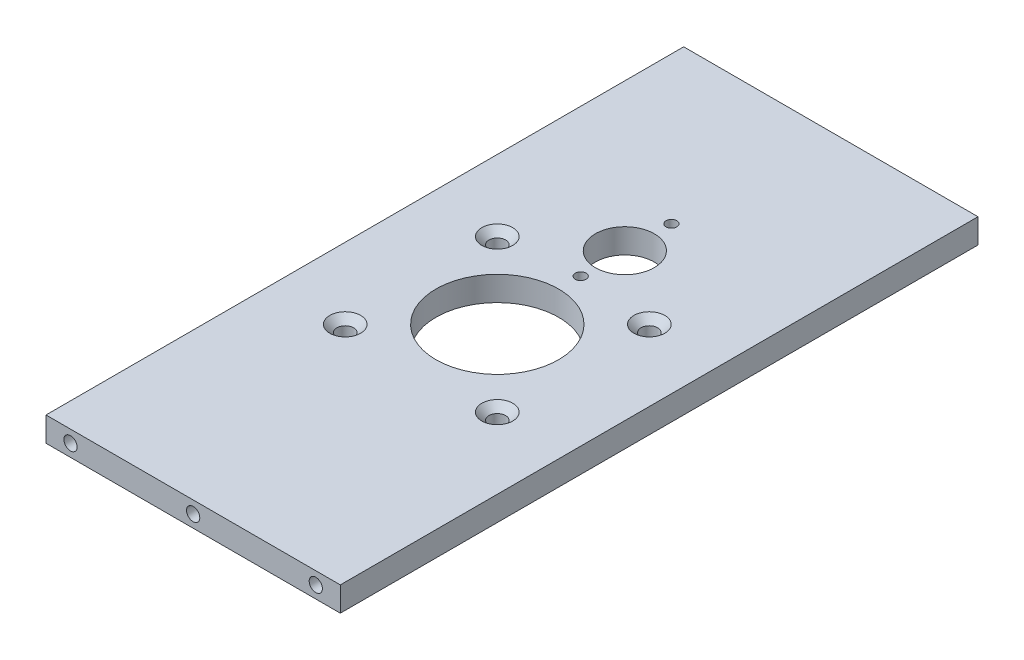
ISO-10303-21;
HEADER;
FILE_DESCRIPTION(('STEP AP214'),'2;1');
FILE_NAME('part.step','',(''),(''),'','','');
FILE_SCHEMA(('AUTOMOTIVE_DESIGN { 1 0 10303 214 1 1 1 1 }'));
ENDSEC;
DATA;
#1=APPLICATION_CONTEXT('core data for automotive mechanical design processes');
#2=APPLICATION_PROTOCOL_DEFINITION('international standard','automotive_design',2000,#1);
#3=PRODUCT_CONTEXT('',#1,'mechanical');
#4=PRODUCT('Part','Part','',(#3));
#5=PRODUCT_RELATED_PRODUCT_CATEGORY('part','',(#4));
#6=PRODUCT_DEFINITION_FORMATION('','',#4);
#7=PRODUCT_DEFINITION_CONTEXT('part definition',#1,'design');
#8=PRODUCT_DEFINITION('design','',#6,#7);
#9=PRODUCT_DEFINITION_SHAPE('','',#8);
#10=(LENGTH_UNIT() NAMED_UNIT(*) SI_UNIT(.MILLI.,.METRE.));
#11=(NAMED_UNIT(*) PLANE_ANGLE_UNIT() SI_UNIT($,.RADIAN.));
#12=(NAMED_UNIT(*) SI_UNIT($,.STERADIAN.) SOLID_ANGLE_UNIT());
#13=UNCERTAINTY_MEASURE_WITH_UNIT(LENGTH_MEASURE(1.E-05),#10,'distance_accuracy_value','');
#14=(GEOMETRIC_REPRESENTATION_CONTEXT(3) GLOBAL_UNCERTAINTY_ASSIGNED_CONTEXT((#13)) GLOBAL_UNIT_ASSIGNED_CONTEXT((#10,
#11,#12)) REPRESENTATION_CONTEXT('',''));
#15=CARTESIAN_POINT('',(0.,0.,0.));
#16=DIRECTION('',(0.,0.,1.));
#17=DIRECTION('',(1.,0.,0.));
#18=AXIS2_PLACEMENT_3D('',#15,#16,#17);
#19=CARTESIAN_POINT('',(30.,5.,65.));
#20=DIRECTION('',(-1.,0.,0.));
#21=DIRECTION('',(0.,0.,1.));
#22=AXIS2_PLACEMENT_3D('',#19,#20,#21);
#23=PLANE('',#22);
#24=DIRECTION('',(0.,0.,-1.));
#25=VECTOR('',#24,1.);
#26=CARTESIAN_POINT('',(30.,0.,65.));
#27=LINE('',#26,#25);
#28=CARTESIAN_POINT('',(30.,0.,65.));
#29=VERTEX_POINT('',#28);
#30=CARTESIAN_POINT('',(30.,0.,-65.));
#31=VERTEX_POINT('',#30);
#32=EDGE_CURVE('E192',#29,#31,#27,.T.);
#33=ORIENTED_EDGE('',*,*,#32,.T.);
#34=DIRECTION('',(0.,-1.,0.));
#35=VECTOR('',#34,1.);
#36=CARTESIAN_POINT('',(30.,5.,-65.));
#37=LINE('',#36,#35);
#38=CARTESIAN_POINT('',(30.,5.,-65.));
#39=VERTEX_POINT('',#38);
#40=EDGE_CURVE('E11',#39,#31,#37,.T.);
#41=ORIENTED_EDGE('',*,*,#40,.F.);
#42=DIRECTION('',(0.,0.,-1.));
#43=VECTOR('',#42,1.);
#44=CARTESIAN_POINT('',(30.,5.,65.));
#45=LINE('',#44,#43);
#46=CARTESIAN_POINT('',(30.,5.,65.));
#47=VERTEX_POINT('',#46);
#48=EDGE_CURVE('E185',#47,#39,#45,.T.);
#49=ORIENTED_EDGE('',*,*,#48,.F.);
#50=DIRECTION('',(0.,-1.,0.));
#51=VECTOR('',#50,1.);
#52=CARTESIAN_POINT('',(30.,5.,65.));
#53=LINE('',#52,#51);
#54=EDGE_CURVE('E191',#47,#29,#53,.T.);
#55=ORIENTED_EDGE('',*,*,#54,.T.);
#56=EDGE_LOOP('',(#33,#41,#49,#55));
#57=FACE_BOUND('',#56,.T.);
#58=ADVANCED_FACE('F37',(#57),#23,.F.);
#59=CARTESIAN_POINT('',(-30.,5.,-65.));
#60=DIRECTION('',(0.,0.,1.));
#61=DIRECTION('',(1.,0.,0.));
#62=AXIS2_PLACEMENT_3D('',#59,#60,#61);
#63=PLANE('',#62);
#64=CARTESIAN_POINT('',(25.,2.5,-65.));
#65=DIRECTION('',(0.,0.,-1.));
#66=DIRECTION('',(-1.,0.,0.));
#67=AXIS2_PLACEMENT_3D('',#64,#65,#66);
#68=CIRCLE('',#67,1.35);
#69=CARTESIAN_POINT('',(23.65,2.5,-65.));
#70=VERTEX_POINT('',#69);
#71=EDGE_CURVE('E134',#70,#70,#68,.T.);
#72=ORIENTED_EDGE('',*,*,#71,.F.);
#73=EDGE_LOOP('',(#72));
#74=FACE_BOUND('',#73,.T.);
#75=CARTESIAN_POINT('',(0.,2.50000000000001,-65.));
#76=DIRECTION('',(0.,0.,-1.));
#77=DIRECTION('',(-1.,0.,0.));
#78=AXIS2_PLACEMENT_3D('',#75,#76,#77);
#79=CIRCLE('',#78,1.35);
#80=CARTESIAN_POINT('',(-1.35,2.50000000000001,-65.));
#81=VERTEX_POINT('',#80);
#82=EDGE_CURVE('E140',#81,#81,#79,.T.);
#83=ORIENTED_EDGE('',*,*,#82,.F.);
#84=EDGE_LOOP('',(#83));
#85=FACE_BOUND('',#84,.T.);
#86=CARTESIAN_POINT('',(-25.,2.50000000000001,-65.));
#87=DIRECTION('',(0.,0.,-1.));
#88=DIRECTION('',(-1.,0.,0.));
#89=AXIS2_PLACEMENT_3D('',#86,#87,#88);
#90=CIRCLE('',#89,1.35);
#91=CARTESIAN_POINT('',(-26.35,2.50000000000001,-65.));
#92=VERTEX_POINT('',#91);
#93=EDGE_CURVE('E146',#92,#92,#90,.T.);
#94=ORIENTED_EDGE('',*,*,#93,.F.);
#95=EDGE_LOOP('',(#94));
#96=FACE_BOUND('',#95,.T.);
#97=DIRECTION('',(-1.,0.,0.));
#98=VECTOR('',#97,1.);
#99=CARTESIAN_POINT('',(-30.,0.,-65.));
#100=LINE('',#99,#98);
#101=CARTESIAN_POINT('',(-30.,0.,-65.));
#102=VERTEX_POINT('',#101);
#103=EDGE_CURVE('E195',#31,#102,#100,.T.);
#104=ORIENTED_EDGE('',*,*,#103,.T.);
#105=DIRECTION('',(0.,-1.,0.));
#106=VECTOR('',#105,1.);
#107=CARTESIAN_POINT('',(-30.,5.,-65.));
#108=LINE('',#107,#106);
#109=CARTESIAN_POINT('',(-30.,5.,-65.));
#110=VERTEX_POINT('',#109);
#111=EDGE_CURVE('E46',#110,#102,#108,.T.);
#112=ORIENTED_EDGE('',*,*,#111,.F.);
#113=DIRECTION('',(-1.,0.,0.));
#114=VECTOR('',#113,1.);
#115=CARTESIAN_POINT('',(-30.,5.,-65.));
#116=LINE('',#115,#114);
#117=EDGE_CURVE('E86',#39,#110,#116,.T.);
#118=ORIENTED_EDGE('',*,*,#117,.F.);
#119=ORIENTED_EDGE('',*,*,#40,.T.);
#120=EDGE_LOOP('',(#104,#112,#118,#119));
#121=FACE_BOUND('',#120,.T.);
#122=ADVANCED_FACE('F230',(#74,#85,#96,#121),#63,.F.);
#123=CARTESIAN_POINT('',(-30.,5.,65.));
#124=DIRECTION('',(1.,0.,0.));
#125=DIRECTION('',(0.,0.,-1.));
#126=AXIS2_PLACEMENT_3D('',#123,#124,#125);
#127=PLANE('',#126);
#128=DIRECTION('',(0.,0.,1.));
#129=VECTOR('',#128,1.);
#130=CARTESIAN_POINT('',(-30.,0.,65.));
#131=LINE('',#130,#129);
#132=CARTESIAN_POINT('',(-30.,0.,65.));
#133=VERTEX_POINT('',#132);
#134=EDGE_CURVE('E73',#102,#133,#131,.T.);
#135=ORIENTED_EDGE('',*,*,#134,.T.);
#136=DIRECTION('',(0.,-1.,0.));
#137=VECTOR('',#136,1.);
#138=CARTESIAN_POINT('',(-30.,5.,65.));
#139=LINE('',#138,#137);
#140=CARTESIAN_POINT('',(-30.,5.,65.));
#141=VERTEX_POINT('',#140);
#142=EDGE_CURVE('E200',#141,#133,#139,.T.);
#143=ORIENTED_EDGE('',*,*,#142,.F.);
#144=DIRECTION('',(0.,0.,1.));
#145=VECTOR('',#144,1.);
#146=CARTESIAN_POINT('',(-30.,5.,65.));
#147=LINE('',#146,#145);
#148=EDGE_CURVE('E188',#110,#141,#147,.T.);
#149=ORIENTED_EDGE('',*,*,#148,.F.);
#150=ORIENTED_EDGE('',*,*,#111,.T.);
#151=EDGE_LOOP('',(#135,#143,#149,#150));
#152=FACE_BOUND('',#151,.T.);
#153=ADVANCED_FACE('F229',(#152),#127,.F.);
#154=CARTESIAN_POINT('',(-30.,5.,65.));
#155=DIRECTION('',(0.,0.,-1.));
#156=DIRECTION('',(-1.,0.,0.));
#157=AXIS2_PLACEMENT_3D('',#154,#155,#156);
#158=PLANE('',#157);
#159=CARTESIAN_POINT('',(25.,2.5,65.));
#160=DIRECTION('',(0.,0.,1.));
#161=DIRECTION('',(1.,0.,0.));
#162=AXIS2_PLACEMENT_3D('',#159,#160,#161);
#163=CIRCLE('',#162,1.35);
#164=CARTESIAN_POINT('',(26.35,2.5,65.));
#165=VERTEX_POINT('',#164);
#166=EDGE_CURVE('E116',#165,#165,#163,.T.);
#167=ORIENTED_EDGE('',*,*,#166,.F.);
#168=EDGE_LOOP('',(#167));
#169=FACE_BOUND('',#168,.T.);
#170=CARTESIAN_POINT('',(0.,2.50000000000001,65.));
#171=DIRECTION('',(0.,0.,1.));
#172=DIRECTION('',(1.,0.,0.));
#173=AXIS2_PLACEMENT_3D('',#170,#171,#172);
#174=CIRCLE('',#173,1.35);
#175=CARTESIAN_POINT('',(1.35,2.50000000000001,65.));
#176=VERTEX_POINT('',#175);
#177=EDGE_CURVE('E115',#176,#176,#174,.T.);
#178=ORIENTED_EDGE('',*,*,#177,.F.);
#179=EDGE_LOOP('',(#178));
#180=FACE_BOUND('',#179,.T.);
#181=CARTESIAN_POINT('',(-25.,2.50000000000001,65.));
#182=DIRECTION('',(0.,0.,1.));
#183=DIRECTION('',(1.,0.,0.));
#184=AXIS2_PLACEMENT_3D('',#181,#182,#183);
#185=CIRCLE('',#184,1.35);
#186=CARTESIAN_POINT('',(-23.65,2.50000000000001,65.));
#187=VERTEX_POINT('',#186);
#188=EDGE_CURVE('E128',#187,#187,#185,.T.);
#189=ORIENTED_EDGE('',*,*,#188,.F.);
#190=EDGE_LOOP('',(#189));
#191=FACE_BOUND('',#190,.T.);
#192=DIRECTION('',(1.,0.,0.));
#193=VECTOR('',#192,1.);
#194=CARTESIAN_POINT('',(-30.,0.,65.));
#195=LINE('',#194,#193);
#196=EDGE_CURVE('E79',#133,#29,#195,.T.);
#197=ORIENTED_EDGE('',*,*,#196,.T.);
#198=ORIENTED_EDGE('',*,*,#54,.F.);
#199=DIRECTION('',(1.,0.,0.));
#200=VECTOR('',#199,1.);
#201=CARTESIAN_POINT('',(-30.,5.,65.));
#202=LINE('',#201,#200);
#203=EDGE_CURVE('E55',#141,#47,#202,.T.);
#204=ORIENTED_EDGE('',*,*,#203,.F.);
#205=ORIENTED_EDGE('',*,*,#142,.T.);
#206=EDGE_LOOP('',(#197,#198,#204,#205));
#207=FACE_BOUND('',#206,.T.);
#208=ADVANCED_FACE('F227',(#169,#180,#191,#207),#158,.F.);
#209=CARTESIAN_POINT('',(0.,5.,0.));
#210=DIRECTION('',(0.,-1.,0.));
#211=DIRECTION('',(0.,0.,-1.));
#212=AXIS2_PLACEMENT_3D('',#209,#210,#211);
#213=PLANE('',#212);
#214=CARTESIAN_POINT('',(0.,5.,-23.));
#215=DIRECTION('',(0.,1.,0.));
#216=DIRECTION('',(0.,0.,1.));
#217=AXIS2_PLACEMENT_3D('',#214,#215,#216);
#218=CIRCLE('',#217,6.);
#219=CARTESIAN_POINT('',(0.,5.,-17.));
#220=VERTEX_POINT('',#219);
#221=EDGE_CURVE('E340',#220,#220,#218,.T.);
#222=ORIENTED_EDGE('',*,*,#221,.F.);
#223=EDGE_LOOP('',(#222));
#224=FACE_BOUND('',#223,.T.);
#225=CARTESIAN_POINT('',(0.,5.,-32.5));
#226=DIRECTION('',(0.,1.,0.));
#227=DIRECTION('',(0.,0.,1.));
#228=AXIS2_PLACEMENT_3D('',#225,#226,#227);
#229=CIRCLE('',#228,1.1);
#230=CARTESIAN_POINT('',(0.,5.,-31.4));
#231=VERTEX_POINT('',#230);
#232=EDGE_CURVE('E342',#231,#231,#229,.T.);
#233=ORIENTED_EDGE('',*,*,#232,.F.);
#234=EDGE_LOOP('',(#233));
#235=FACE_BOUND('',#234,.T.);
#236=CARTESIAN_POINT('',(0.,5.,-14.));
#237=DIRECTION('',(0.,1.,0.));
#238=DIRECTION('',(0.,0.,1.));
#239=AXIS2_PLACEMENT_3D('',#236,#237,#238);
#240=CIRCLE('',#239,1.1);
#241=CARTESIAN_POINT('',(0.,5.,-12.9));
#242=VERTEX_POINT('',#241);
#243=EDGE_CURVE('E350',#242,#242,#240,.T.);
#244=ORIENTED_EDGE('',*,*,#243,.F.);
#245=EDGE_LOOP('',(#244));
#246=FACE_BOUND('',#245,.T.);
#247=CARTESIAN_POINT('',(0.,5.,3.00000000000002));
#248=DIRECTION('',(0.,1.,0.));
#249=DIRECTION('',(0.,0.,1.));
#250=AXIS2_PLACEMENT_3D('',#247,#248,#249);
#251=CIRCLE('',#250,12.5);
#252=CARTESIAN_POINT('',(0.,5.,15.5));
#253=VERTEX_POINT('',#252);
#254=EDGE_CURVE('E152',#253,#253,#251,.T.);
#255=ORIENTED_EDGE('',*,*,#254,.F.);
#256=EDGE_LOOP('',(#255));
#257=FACE_BOUND('',#256,.T.);
#258=CARTESIAN_POINT('',(-15.5,5.,-12.5));
#259=DIRECTION('',(0.,1.,0.));
#260=DIRECTION('',(0.,0.,1.));
#261=AXIS2_PLACEMENT_3D('',#258,#259,#260);
#262=CIRCLE('',#261,3.15);
#263=CARTESIAN_POINT('',(-15.5,5.,-9.34999999999999));
#264=VERTEX_POINT('',#263);
#265=EDGE_CURVE('E156',#264,#264,#262,.T.);
#266=ORIENTED_EDGE('',*,*,#265,.F.);
#267=EDGE_LOOP('',(#266));
#268=FACE_BOUND('',#267,.T.);
#269=CARTESIAN_POINT('',(-15.5,5.,18.5));
#270=DIRECTION('',(0.,1.,0.));
#271=DIRECTION('',(0.,0.,1.));
#272=AXIS2_PLACEMENT_3D('',#269,#270,#271);
#273=CIRCLE('',#272,3.15);
#274=CARTESIAN_POINT('',(-15.5,5.,21.65));
#275=VERTEX_POINT('',#274);
#276=EDGE_CURVE('E164',#275,#275,#273,.T.);
#277=ORIENTED_EDGE('',*,*,#276,.F.);
#278=EDGE_LOOP('',(#277));
#279=FACE_BOUND('',#278,.T.);
#280=CARTESIAN_POINT('',(15.5,5.,-12.5));
#281=DIRECTION('',(0.,1.,0.));
#282=DIRECTION('',(0.,0.,1.));
#283=AXIS2_PLACEMENT_3D('',#280,#281,#282);
#284=CIRCLE('',#283,3.15);
#285=CARTESIAN_POINT('',(15.5,5.,-9.34999999999999));
#286=VERTEX_POINT('',#285);
#287=EDGE_CURVE('E171',#286,#286,#284,.T.);
#288=ORIENTED_EDGE('',*,*,#287,.F.);
#289=EDGE_LOOP('',(#288));
#290=FACE_BOUND('',#289,.T.);
#291=CARTESIAN_POINT('',(15.5,5.,18.5));
#292=DIRECTION('',(0.,1.,0.));
#293=DIRECTION('',(0.,0.,1.));
#294=AXIS2_PLACEMENT_3D('',#291,#292,#293);
#295=CIRCLE('',#294,3.15);
#296=CARTESIAN_POINT('',(15.5,5.,21.65));
#297=VERTEX_POINT('',#296);
#298=EDGE_CURVE('E178',#297,#297,#295,.T.);
#299=ORIENTED_EDGE('',*,*,#298,.F.);
#300=EDGE_LOOP('',(#299));
#301=FACE_BOUND('',#300,.T.);
#302=ORIENTED_EDGE('',*,*,#48,.T.);
#303=ORIENTED_EDGE('',*,*,#117,.T.);
#304=ORIENTED_EDGE('',*,*,#148,.T.);
#305=ORIENTED_EDGE('',*,*,#203,.T.);
#306=EDGE_LOOP('',(#302,#303,#304,#305));
#307=FACE_BOUND('',#306,.T.);
#308=ADVANCED_FACE('F216',(#224,#235,#246,#257,#268,#279,#290,#301,#307),#213,.F.);
#309=CARTESIAN_POINT('',(0.,0.,0.));
#310=DIRECTION('',(0.,-1.,0.));
#311=DIRECTION('',(0.,0.,-1.));
#312=AXIS2_PLACEMENT_3D('',#309,#310,#311);
#313=PLANE('',#312);
#314=CARTESIAN_POINT('',(0.,0.,-23.));
#315=DIRECTION('',(0.,1.,0.));
#316=DIRECTION('',(0.,0.,1.));
#317=AXIS2_PLACEMENT_3D('',#314,#315,#316);
#318=CIRCLE('',#317,6.);
#319=CARTESIAN_POINT('',(0.,0.,-17.));
#320=VERTEX_POINT('',#319);
#321=EDGE_CURVE('E337',#320,#320,#318,.T.);
#322=ORIENTED_EDGE('',*,*,#321,.T.);
#323=EDGE_LOOP('',(#322));
#324=FACE_BOUND('',#323,.T.);
#325=CARTESIAN_POINT('',(0.,0.,-32.5));
#326=DIRECTION('',(0.,1.,0.));
#327=DIRECTION('',(0.,0.,1.));
#328=AXIS2_PLACEMENT_3D('',#325,#326,#327);
#329=CIRCLE('',#328,1.1);
#330=CARTESIAN_POINT('',(0.,0.,-31.4));
#331=VERTEX_POINT('',#330);
#332=EDGE_CURVE('E347',#331,#331,#329,.T.);
#333=ORIENTED_EDGE('',*,*,#332,.T.);
#334=EDGE_LOOP('',(#333));
#335=FACE_BOUND('',#334,.T.);
#336=CARTESIAN_POINT('',(0.,0.,-14.));
#337=DIRECTION('',(0.,1.,0.));
#338=DIRECTION('',(0.,0.,1.));
#339=AXIS2_PLACEMENT_3D('',#336,#337,#338);
#340=CIRCLE('',#339,1.1);
#341=CARTESIAN_POINT('',(0.,0.,-12.9));
#342=VERTEX_POINT('',#341);
#343=EDGE_CURVE('E122',#342,#342,#340,.T.);
#344=ORIENTED_EDGE('',*,*,#343,.T.);
#345=EDGE_LOOP('',(#344));
#346=FACE_BOUND('',#345,.T.);
#347=CARTESIAN_POINT('',(0.,0.,3.00000000000002));
#348=DIRECTION('',(0.,1.,0.));
#349=DIRECTION('',(0.,0.,1.));
#350=AXIS2_PLACEMENT_3D('',#347,#348,#349);
#351=CIRCLE('',#350,12.5);
#352=CARTESIAN_POINT('',(0.,0.,15.5));
#353=VERTEX_POINT('',#352);
#354=EDGE_CURVE('E153',#353,#353,#351,.T.);
#355=ORIENTED_EDGE('',*,*,#354,.T.);
#356=EDGE_LOOP('',(#355));
#357=FACE_BOUND('',#356,.T.);
#358=CARTESIAN_POINT('',(-15.5,0.,-12.5));
#359=DIRECTION('',(0.,-1.,0.));
#360=DIRECTION('',(0.,0.,-1.));
#361=AXIS2_PLACEMENT_3D('',#358,#359,#360);
#362=CIRCLE('',#361,1.69999999999999);
#363=CARTESIAN_POINT('',(-15.5,0.,-14.2));
#364=VERTEX_POINT('',#363);
#365=EDGE_CURVE('E40',#364,#364,#362,.T.);
#366=ORIENTED_EDGE('',*,*,#365,.F.);
#367=EDGE_LOOP('',(#366));
#368=FACE_BOUND('',#367,.T.);
#369=CARTESIAN_POINT('',(-15.5,0.,18.5));
#370=DIRECTION('',(0.,-1.,0.));
#371=DIRECTION('',(0.,0.,-1.));
#372=AXIS2_PLACEMENT_3D('',#369,#370,#371);
#373=CIRCLE('',#372,1.69999999999999);
#374=CARTESIAN_POINT('',(-15.5,0.,16.8));
#375=VERTEX_POINT('',#374);
#376=EDGE_CURVE('E170',#375,#375,#373,.T.);
#377=ORIENTED_EDGE('',*,*,#376,.F.);
#378=EDGE_LOOP('',(#377));
#379=FACE_BOUND('',#378,.T.);
#380=CARTESIAN_POINT('',(15.5,0.,-12.5));
#381=DIRECTION('',(0.,-1.,0.));
#382=DIRECTION('',(0.,0.,-1.));
#383=AXIS2_PLACEMENT_3D('',#380,#381,#382);
#384=CIRCLE('',#383,1.69999999999999);
#385=CARTESIAN_POINT('',(15.5,0.,-14.2));
#386=VERTEX_POINT('',#385);
#387=EDGE_CURVE('E177',#386,#386,#384,.T.);
#388=ORIENTED_EDGE('',*,*,#387,.F.);
#389=EDGE_LOOP('',(#388));
#390=FACE_BOUND('',#389,.T.);
#391=CARTESIAN_POINT('',(15.5,0.,18.5));
#392=DIRECTION('',(0.,-1.,0.));
#393=DIRECTION('',(0.,0.,-1.));
#394=AXIS2_PLACEMENT_3D('',#391,#392,#393);
#395=CIRCLE('',#394,1.69999999999999);
#396=CARTESIAN_POINT('',(15.5,0.,16.8));
#397=VERTEX_POINT('',#396);
#398=EDGE_CURVE('E184',#397,#397,#395,.T.);
#399=ORIENTED_EDGE('',*,*,#398,.F.);
#400=EDGE_LOOP('',(#399));
#401=FACE_BOUND('',#400,.T.);
#402=ORIENTED_EDGE('',*,*,#32,.F.);
#403=ORIENTED_EDGE('',*,*,#196,.F.);
#404=ORIENTED_EDGE('',*,*,#134,.F.);
#405=ORIENTED_EDGE('',*,*,#103,.F.);
#406=EDGE_LOOP('',(#402,#403,#404,#405));
#407=FACE_BOUND('',#406,.T.);
#408=ADVANCED_FACE('F212',(#324,#335,#346,#357,#368,#379,#390,#401,#407),#313,.T.);
#409=CARTESIAN_POINT('',(15.5,5.,18.5));
#410=DIRECTION('',(0.,1.,0.));
#411=DIRECTION('',(0.,0.,1.));
#412=AXIS2_PLACEMENT_3D('',#409,#410,#411);
#413=CYLINDRICAL_SURFACE('',#412,1.69999999999999);
#414=ORIENTED_EDGE('',*,*,#398,.T.);
#415=EDGE_LOOP('',(#414));
#416=FACE_BOUND('',#415,.T.);
#417=CARTESIAN_POINT('',(15.5,3.55,18.5));
#418=DIRECTION('',(0.,1.,0.));
#419=DIRECTION('',(0.,0.,1.));
#420=AXIS2_PLACEMENT_3D('',#417,#418,#419);
#421=CIRCLE('',#420,1.7);
#422=CARTESIAN_POINT('',(15.5,3.55,20.2));
#423=VERTEX_POINT('',#422);
#424=EDGE_CURVE('E181',#423,#423,#421,.T.);
#425=ORIENTED_EDGE('',*,*,#424,.T.);
#426=EDGE_LOOP('',(#425));
#427=FACE_BOUND('',#426,.T.);
#428=ADVANCED_FACE('F215',(#416,#427),#413,.F.);
#429=CARTESIAN_POINT('',(15.5,5.,18.5));
#430=DIRECTION('',(0.,1.,0.));
#431=DIRECTION('',(0.,0.,1.));
#432=AXIS2_PLACEMENT_3D('',#429,#430,#431);
#433=CONICAL_SURFACE('',#432,3.15,0.785398163397448);
#434=ORIENTED_EDGE('',*,*,#424,.F.);
#435=EDGE_LOOP('',(#434));
#436=FACE_BOUND('',#435,.T.);
#437=ORIENTED_EDGE('',*,*,#298,.T.);
#438=EDGE_LOOP('',(#437));
#439=FACE_BOUND('',#438,.T.);
#440=ADVANCED_FACE('F249',(#436,#439),#433,.F.);
#441=CARTESIAN_POINT('',(15.5,5.,-12.5));
#442=DIRECTION('',(0.,1.,0.));
#443=DIRECTION('',(0.,0.,1.));
#444=AXIS2_PLACEMENT_3D('',#441,#442,#443);
#445=CYLINDRICAL_SURFACE('',#444,1.69999999999999);
#446=ORIENTED_EDGE('',*,*,#387,.T.);
#447=EDGE_LOOP('',(#446));
#448=FACE_BOUND('',#447,.T.);
#449=CARTESIAN_POINT('',(15.5,3.55,-12.5));
#450=DIRECTION('',(0.,1.,0.));
#451=DIRECTION('',(0.,0.,1.));
#452=AXIS2_PLACEMENT_3D('',#449,#450,#451);
#453=CIRCLE('',#452,1.7);
#454=CARTESIAN_POINT('',(15.5,3.55,-10.8));
#455=VERTEX_POINT('',#454);
#456=EDGE_CURVE('E174',#455,#455,#453,.T.);
#457=ORIENTED_EDGE('',*,*,#456,.T.);
#458=EDGE_LOOP('',(#457));
#459=FACE_BOUND('',#458,.T.);
#460=ADVANCED_FACE('F253',(#448,#459),#445,.F.);
#461=CARTESIAN_POINT('',(15.5,5.,-12.5));
#462=DIRECTION('',(0.,1.,0.));
#463=DIRECTION('',(0.,0.,1.));
#464=AXIS2_PLACEMENT_3D('',#461,#462,#463);
#465=CONICAL_SURFACE('',#464,3.15,0.785398163397448);
#466=ORIENTED_EDGE('',*,*,#456,.F.);
#467=EDGE_LOOP('',(#466));
#468=FACE_BOUND('',#467,.T.);
#469=ORIENTED_EDGE('',*,*,#287,.T.);
#470=EDGE_LOOP('',(#469));
#471=FACE_BOUND('',#470,.T.);
#472=ADVANCED_FACE('F257',(#468,#471),#465,.F.);
#473=CARTESIAN_POINT('',(-15.5,5.,18.5));
#474=DIRECTION('',(0.,1.,0.));
#475=DIRECTION('',(0.,0.,1.));
#476=AXIS2_PLACEMENT_3D('',#473,#474,#475);
#477=CYLINDRICAL_SURFACE('',#476,1.69999999999999);
#478=ORIENTED_EDGE('',*,*,#376,.T.);
#479=EDGE_LOOP('',(#478));
#480=FACE_BOUND('',#479,.T.);
#481=CARTESIAN_POINT('',(-15.5,3.55,18.5));
#482=DIRECTION('',(0.,1.,0.));
#483=DIRECTION('',(0.,0.,1.));
#484=AXIS2_PLACEMENT_3D('',#481,#482,#483);
#485=CIRCLE('',#484,1.7);
#486=CARTESIAN_POINT('',(-15.5,3.55,20.2));
#487=VERTEX_POINT('',#486);
#488=EDGE_CURVE('E167',#487,#487,#485,.T.);
#489=ORIENTED_EDGE('',*,*,#488,.T.);
#490=EDGE_LOOP('',(#489));
#491=FACE_BOUND('',#490,.T.);
#492=ADVANCED_FACE('F209',(#480,#491),#477,.F.);
#493=CARTESIAN_POINT('',(-15.5,5.,18.5));
#494=DIRECTION('',(0.,1.,0.));
#495=DIRECTION('',(0.,0.,1.));
#496=AXIS2_PLACEMENT_3D('',#493,#494,#495);
#497=CONICAL_SURFACE('',#496,3.15,0.785398163397449);
#498=ORIENTED_EDGE('',*,*,#488,.F.);
#499=EDGE_LOOP('',(#498));
#500=FACE_BOUND('',#499,.T.);
#501=ORIENTED_EDGE('',*,*,#276,.T.);
#502=EDGE_LOOP('',(#501));
#503=FACE_BOUND('',#502,.T.);
#504=ADVANCED_FACE('F264',(#500,#503),#497,.F.);
#505=CARTESIAN_POINT('',(-15.5,5.,-12.5));
#506=DIRECTION('',(0.,1.,0.));
#507=DIRECTION('',(0.,0.,1.));
#508=AXIS2_PLACEMENT_3D('',#505,#506,#507);
#509=CYLINDRICAL_SURFACE('',#508,1.69999999999999);
#510=ORIENTED_EDGE('',*,*,#365,.T.);
#511=EDGE_LOOP('',(#510));
#512=FACE_BOUND('',#511,.T.);
#513=CARTESIAN_POINT('',(-15.5,3.55,-12.5));
#514=DIRECTION('',(0.,1.,0.));
#515=DIRECTION('',(0.,0.,1.));
#516=AXIS2_PLACEMENT_3D('',#513,#514,#515);
#517=CIRCLE('',#516,1.7);
#518=CARTESIAN_POINT('',(-15.5,3.55,-10.8));
#519=VERTEX_POINT('',#518);
#520=EDGE_CURVE('E161',#519,#519,#517,.T.);
#521=ORIENTED_EDGE('',*,*,#520,.T.);
#522=EDGE_LOOP('',(#521));
#523=FACE_BOUND('',#522,.T.);
#524=ADVANCED_FACE('F267',(#512,#523),#509,.F.);
#525=CARTESIAN_POINT('',(-15.5,5.,-12.5));
#526=DIRECTION('',(0.,1.,0.));
#527=DIRECTION('',(0.,0.,1.));
#528=AXIS2_PLACEMENT_3D('',#525,#526,#527);
#529=CONICAL_SURFACE('',#528,3.15,0.785398163397449);
#530=ORIENTED_EDGE('',*,*,#520,.F.);
#531=EDGE_LOOP('',(#530));
#532=FACE_BOUND('',#531,.T.);
#533=ORIENTED_EDGE('',*,*,#265,.T.);
#534=EDGE_LOOP('',(#533));
#535=FACE_BOUND('',#534,.T.);
#536=ADVANCED_FACE('F271',(#532,#535),#529,.F.);
#537=CARTESIAN_POINT('',(0.,0.,3.00000000000002));
#538=DIRECTION('',(0.,1.,0.));
#539=DIRECTION('',(0.,0.,1.));
#540=AXIS2_PLACEMENT_3D('',#537,#538,#539);
#541=CYLINDRICAL_SURFACE('',#540,12.5);
#542=ORIENTED_EDGE('',*,*,#354,.F.);
#543=EDGE_LOOP('',(#542));
#544=FACE_BOUND('',#543,.T.);
#545=ORIENTED_EDGE('',*,*,#254,.T.);
#546=EDGE_LOOP('',(#545));
#547=FACE_BOUND('',#546,.T.);
#548=ADVANCED_FACE('F275',(#544,#547),#541,.F.);
#549=CARTESIAN_POINT('',(-25.,2.50000000000001,-57.5));
#550=DIRECTION('',(0.,0.,-1.));
#551=DIRECTION('',(-1.,0.,0.));
#552=AXIS2_PLACEMENT_3D('',#549,#550,#551);
#553=CONICAL_SURFACE('',#552,1.35,1.02974425867665);
#554=CARTESIAN_POINT('',(-25.,2.50000000000001,-56.6888381643128));
#555=VERTEX_POINT('',#554);
#556=VERTEX_LOOP('',#555);
#557=FACE_BOUND('',#556,.T.);
#558=CARTESIAN_POINT('',(-25.,2.50000000000001,-57.5));
#559=DIRECTION('',(0.,0.,-1.));
#560=DIRECTION('',(-1.,0.,0.));
#561=AXIS2_PLACEMENT_3D('',#558,#559,#560);
#562=CIRCLE('',#561,1.35);
#563=CARTESIAN_POINT('',(-26.35,2.50000000000001,-57.5));
#564=VERTEX_POINT('',#563);
#565=EDGE_CURVE('E149',#564,#564,#562,.T.);
#566=ORIENTED_EDGE('',*,*,#565,.T.);
#567=EDGE_LOOP('',(#566));
#568=FACE_BOUND('',#567,.T.);
#569=ADVANCED_FACE('F279',(#557,#568),#553,.F.);
#570=CARTESIAN_POINT('',(-25.,2.50000000000001,-65.));
#571=DIRECTION('',(0.,0.,-1.));
#572=DIRECTION('',(-1.,0.,0.));
#573=AXIS2_PLACEMENT_3D('',#570,#571,#572);
#574=CYLINDRICAL_SURFACE('',#573,1.35);
#575=ORIENTED_EDGE('',*,*,#565,.F.);
#576=EDGE_LOOP('',(#575));
#577=FACE_BOUND('',#576,.T.);
#578=ORIENTED_EDGE('',*,*,#93,.T.);
#579=EDGE_LOOP('',(#578));
#580=FACE_BOUND('',#579,.T.);
#581=ADVANCED_FACE('F283',(#577,#580),#574,.F.);
#582=CARTESIAN_POINT('',(0.,2.50000000000001,-57.5));
#583=DIRECTION('',(0.,0.,-1.));
#584=DIRECTION('',(-1.,0.,0.));
#585=AXIS2_PLACEMENT_3D('',#582,#583,#584);
#586=CONICAL_SURFACE('',#585,1.35,1.02974425867665);
#587=CARTESIAN_POINT('',(0.,2.50000000000001,-56.6888381643128));
#588=VERTEX_POINT('',#587);
#589=VERTEX_LOOP('',#588);
#590=FACE_BOUND('',#589,.T.);
#591=CARTESIAN_POINT('',(0.,2.50000000000001,-57.5));
#592=DIRECTION('',(0.,0.,-1.));
#593=DIRECTION('',(-1.,0.,0.));
#594=AXIS2_PLACEMENT_3D('',#591,#592,#593);
#595=CIRCLE('',#594,1.35);
#596=CARTESIAN_POINT('',(-1.35,2.50000000000001,-57.5));
#597=VERTEX_POINT('',#596);
#598=EDGE_CURVE('E143',#597,#597,#595,.T.);
#599=ORIENTED_EDGE('',*,*,#598,.T.);
#600=EDGE_LOOP('',(#599));
#601=FACE_BOUND('',#600,.T.);
#602=ADVANCED_FACE('F287',(#590,#601),#586,.F.);
#603=CARTESIAN_POINT('',(0.,2.50000000000001,-65.));
#604=DIRECTION('',(0.,0.,-1.));
#605=DIRECTION('',(-1.,0.,0.));
#606=AXIS2_PLACEMENT_3D('',#603,#604,#605);
#607=CYLINDRICAL_SURFACE('',#606,1.35);
#608=ORIENTED_EDGE('',*,*,#598,.F.);
#609=EDGE_LOOP('',(#608));
#610=FACE_BOUND('',#609,.T.);
#611=ORIENTED_EDGE('',*,*,#82,.T.);
#612=EDGE_LOOP('',(#611));
#613=FACE_BOUND('',#612,.T.);
#614=ADVANCED_FACE('F291',(#610,#613),#607,.F.);
#615=CARTESIAN_POINT('',(25.,2.5,-57.5));
#616=DIRECTION('',(0.,0.,-1.));
#617=DIRECTION('',(-1.,0.,0.));
#618=AXIS2_PLACEMENT_3D('',#615,#616,#617);
#619=CONICAL_SURFACE('',#618,1.35,1.02974425867665);
#620=CARTESIAN_POINT('',(25.,2.5,-56.6888381643128));
#621=VERTEX_POINT('',#620);
#622=VERTEX_LOOP('',#621);
#623=FACE_BOUND('',#622,.T.);
#624=CARTESIAN_POINT('',(25.,2.5,-57.5));
#625=DIRECTION('',(0.,0.,-1.));
#626=DIRECTION('',(-1.,0.,0.));
#627=AXIS2_PLACEMENT_3D('',#624,#625,#626);
#628=CIRCLE('',#627,1.35);
#629=CARTESIAN_POINT('',(23.65,2.5,-57.5));
#630=VERTEX_POINT('',#629);
#631=EDGE_CURVE('E137',#630,#630,#628,.T.);
#632=ORIENTED_EDGE('',*,*,#631,.T.);
#633=EDGE_LOOP('',(#632));
#634=FACE_BOUND('',#633,.T.);
#635=ADVANCED_FACE('F295',(#623,#634),#619,.F.);
#636=CARTESIAN_POINT('',(25.,2.5,-65.));
#637=DIRECTION('',(0.,0.,-1.));
#638=DIRECTION('',(-1.,0.,0.));
#639=AXIS2_PLACEMENT_3D('',#636,#637,#638);
#640=CYLINDRICAL_SURFACE('',#639,1.35);
#641=ORIENTED_EDGE('',*,*,#631,.F.);
#642=EDGE_LOOP('',(#641));
#643=FACE_BOUND('',#642,.T.);
#644=ORIENTED_EDGE('',*,*,#71,.T.);
#645=EDGE_LOOP('',(#644));
#646=FACE_BOUND('',#645,.T.);
#647=ADVANCED_FACE('F299',(#643,#646),#640,.F.);
#648=CARTESIAN_POINT('',(-25.,2.50000000000001,57.5));
#649=DIRECTION('',(0.,0.,1.));
#650=DIRECTION('',(1.,0.,0.));
#651=AXIS2_PLACEMENT_3D('',#648,#649,#650);
#652=CONICAL_SURFACE('',#651,1.35,1.02974425867665);
#653=CARTESIAN_POINT('',(-25.,2.50000000000001,56.6888381643128));
#654=VERTEX_POINT('',#653);
#655=VERTEX_LOOP('',#654);
#656=FACE_BOUND('',#655,.T.);
#657=CARTESIAN_POINT('',(-25.,2.50000000000001,57.5));
#658=DIRECTION('',(0.,0.,1.));
#659=DIRECTION('',(1.,0.,0.));
#660=AXIS2_PLACEMENT_3D('',#657,#658,#659);
#661=CIRCLE('',#660,1.35);
#662=CARTESIAN_POINT('',(-23.65,2.50000000000001,57.5));
#663=VERTEX_POINT('',#662);
#664=EDGE_CURVE('E131',#663,#663,#661,.T.);
#665=ORIENTED_EDGE('',*,*,#664,.T.);
#666=EDGE_LOOP('',(#665));
#667=FACE_BOUND('',#666,.T.);
#668=ADVANCED_FACE('F303',(#656,#667),#652,.F.);
#669=CARTESIAN_POINT('',(-25.,2.50000000000001,65.));
#670=DIRECTION('',(0.,0.,1.));
#671=DIRECTION('',(1.,0.,0.));
#672=AXIS2_PLACEMENT_3D('',#669,#670,#671);
#673=CYLINDRICAL_SURFACE('',#672,1.35);
#674=ORIENTED_EDGE('',*,*,#664,.F.);
#675=EDGE_LOOP('',(#674));
#676=FACE_BOUND('',#675,.T.);
#677=ORIENTED_EDGE('',*,*,#188,.T.);
#678=EDGE_LOOP('',(#677));
#679=FACE_BOUND('',#678,.T.);
#680=ADVANCED_FACE('F307',(#676,#679),#673,.F.);
#681=CARTESIAN_POINT('',(0.,2.50000000000001,57.5));
#682=DIRECTION('',(0.,0.,1.));
#683=DIRECTION('',(1.,0.,0.));
#684=AXIS2_PLACEMENT_3D('',#681,#682,#683);
#685=CONICAL_SURFACE('',#684,1.35,1.02974425867665);
#686=CARTESIAN_POINT('',(0.,2.50000000000001,56.6888381643128));
#687=VERTEX_POINT('',#686);
#688=VERTEX_LOOP('',#687);
#689=FACE_BOUND('',#688,.T.);
#690=CARTESIAN_POINT('',(0.,2.50000000000001,57.5));
#691=DIRECTION('',(0.,0.,1.));
#692=DIRECTION('',(1.,0.,0.));
#693=AXIS2_PLACEMENT_3D('',#690,#691,#692);
#694=CIRCLE('',#693,1.35);
#695=CARTESIAN_POINT('',(1.35,2.50000000000001,57.5));
#696=VERTEX_POINT('',#695);
#697=EDGE_CURVE('E119',#696,#696,#694,.T.);
#698=ORIENTED_EDGE('',*,*,#697,.T.);
#699=EDGE_LOOP('',(#698));
#700=FACE_BOUND('',#699,.T.);
#701=ADVANCED_FACE('F311',(#689,#700),#685,.F.);
#702=CARTESIAN_POINT('',(0.,2.50000000000001,65.));
#703=DIRECTION('',(0.,0.,1.));
#704=DIRECTION('',(1.,0.,0.));
#705=AXIS2_PLACEMENT_3D('',#702,#703,#704);
#706=CYLINDRICAL_SURFACE('',#705,1.35);
#707=ORIENTED_EDGE('',*,*,#697,.F.);
#708=EDGE_LOOP('',(#707));
#709=FACE_BOUND('',#708,.T.);
#710=ORIENTED_EDGE('',*,*,#177,.T.);
#711=EDGE_LOOP('',(#710));
#712=FACE_BOUND('',#711,.T.);
#713=ADVANCED_FACE('F109',(#709,#712),#706,.F.);
#714=CARTESIAN_POINT('',(25.,2.5,57.5));
#715=DIRECTION('',(0.,0.,1.));
#716=DIRECTION('',(1.,0.,0.));
#717=AXIS2_PLACEMENT_3D('',#714,#715,#716);
#718=CONICAL_SURFACE('',#717,1.35,1.02974425867665);
#719=CARTESIAN_POINT('',(25.,2.5,56.6888381643128));
#720=VERTEX_POINT('',#719);
#721=VERTEX_LOOP('',#720);
#722=FACE_BOUND('',#721,.T.);
#723=CARTESIAN_POINT('',(25.,2.5,57.5));
#724=DIRECTION('',(0.,0.,1.));
#725=DIRECTION('',(1.,0.,0.));
#726=AXIS2_PLACEMENT_3D('',#723,#724,#725);
#727=CIRCLE('',#726,1.35);
#728=CARTESIAN_POINT('',(26.35,2.5,57.5));
#729=VERTEX_POINT('',#728);
#730=EDGE_CURVE('E113',#729,#729,#727,.T.);
#731=ORIENTED_EDGE('',*,*,#730,.T.);
#732=EDGE_LOOP('',(#731));
#733=FACE_BOUND('',#732,.T.);
#734=ADVANCED_FACE('F105',(#722,#733),#718,.F.);
#735=CARTESIAN_POINT('',(25.,2.5,65.));
#736=DIRECTION('',(0.,0.,1.));
#737=DIRECTION('',(1.,0.,0.));
#738=AXIS2_PLACEMENT_3D('',#735,#736,#737);
#739=CYLINDRICAL_SURFACE('',#738,1.35);
#740=ORIENTED_EDGE('',*,*,#730,.F.);
#741=EDGE_LOOP('',(#740));
#742=FACE_BOUND('',#741,.T.);
#743=ORIENTED_EDGE('',*,*,#166,.T.);
#744=EDGE_LOOP('',(#743));
#745=FACE_BOUND('',#744,.T.);
#746=ADVANCED_FACE('F108',(#742,#745),#739,.F.);
#747=CARTESIAN_POINT('',(0.,5.,-14.));
#748=DIRECTION('',(0.,1.,0.));
#749=DIRECTION('',(0.,0.,1.));
#750=AXIS2_PLACEMENT_3D('',#747,#748,#749);
#751=CYLINDRICAL_SURFACE('',#750,1.1);
#752=ORIENTED_EDGE('',*,*,#343,.F.);
#753=EDGE_LOOP('',(#752));
#754=FACE_BOUND('',#753,.T.);
#755=ORIENTED_EDGE('',*,*,#243,.T.);
#756=EDGE_LOOP('',(#755));
#757=FACE_BOUND('',#756,.T.);
#758=ADVANCED_FACE('F321',(#754,#757),#751,.F.);
#759=CARTESIAN_POINT('',(0.,5.,-32.5));
#760=DIRECTION('',(0.,1.,0.));
#761=DIRECTION('',(0.,0.,1.));
#762=AXIS2_PLACEMENT_3D('',#759,#760,#761);
#763=CYLINDRICAL_SURFACE('',#762,1.1);
#764=ORIENTED_EDGE('',*,*,#332,.F.);
#765=EDGE_LOOP('',(#764));
#766=FACE_BOUND('',#765,.T.);
#767=ORIENTED_EDGE('',*,*,#232,.T.);
#768=EDGE_LOOP('',(#767));
#769=FACE_BOUND('',#768,.T.);
#770=ADVANCED_FACE('F324',(#766,#769),#763,.F.);
#771=CARTESIAN_POINT('',(0.,0.,-23.));
#772=DIRECTION('',(0.,1.,0.));
#773=DIRECTION('',(0.,0.,1.));
#774=AXIS2_PLACEMENT_3D('',#771,#772,#773);
#775=CYLINDRICAL_SURFACE('',#774,6.);
#776=ORIENTED_EDGE('',*,*,#321,.F.);
#777=EDGE_LOOP('',(#776));
#778=FACE_BOUND('',#777,.T.);
#779=ORIENTED_EDGE('',*,*,#221,.T.);
#780=EDGE_LOOP('',(#779));
#781=FACE_BOUND('',#780,.T.);
#782=ADVANCED_FACE('F328',(#778,#781),#775,.F.);
#783=CLOSED_SHELL('',(#58,#122,#153,#208,#308,#408,#428,#440,#460,#472,#492,#504,#524,#536,#548,
#569,#581,#602,#614,#635,#647,#668,#680,#701,#713,#734,#746,#758,#770,#782));
#784=MANIFOLD_SOLID_BREP('B2',#783);
#785=ADVANCED_BREP_SHAPE_REPRESENTATION('',(#18,#784),#14);
#786=SHAPE_DEFINITION_REPRESENTATION(#9,#785);
ENDSEC;
END-ISO-10303-21;
